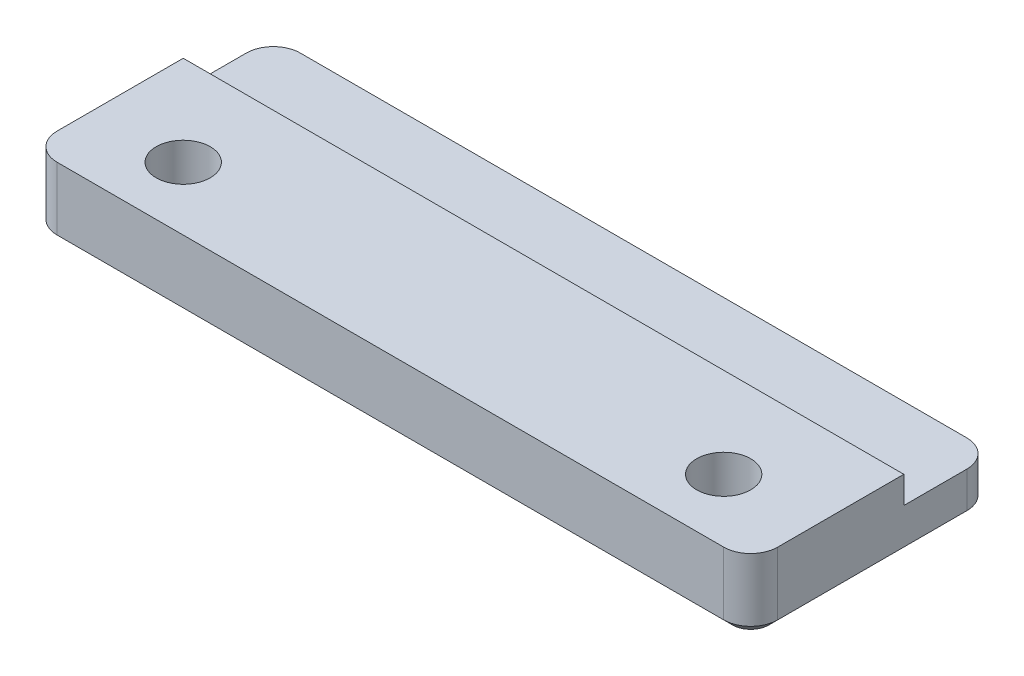
ISO-10303-21;
HEADER;
FILE_DESCRIPTION(('STEP AP214'),'2;1');
FILE_NAME('part.step','',(''),(''),'','','');
FILE_SCHEMA(('AUTOMOTIVE_DESIGN { 1 0 10303 214 1 1 1 1 }'));
ENDSEC;
DATA;
#1=APPLICATION_CONTEXT('core data for automotive mechanical design processes');
#2=APPLICATION_PROTOCOL_DEFINITION('international standard','automotive_design',2000,#1);
#3=PRODUCT_CONTEXT('',#1,'mechanical');
#4=PRODUCT('Part','Part','',(#3));
#5=PRODUCT_RELATED_PRODUCT_CATEGORY('part','',(#4));
#6=PRODUCT_DEFINITION_FORMATION('','',#4);
#7=PRODUCT_DEFINITION_CONTEXT('part definition',#1,'design');
#8=PRODUCT_DEFINITION('design','',#6,#7);
#9=PRODUCT_DEFINITION_SHAPE('','',#8);
#10=(LENGTH_UNIT() NAMED_UNIT(*) SI_UNIT(.MILLI.,.METRE.));
#11=(NAMED_UNIT(*) PLANE_ANGLE_UNIT() SI_UNIT($,.RADIAN.));
#12=(NAMED_UNIT(*) SI_UNIT($,.STERADIAN.) SOLID_ANGLE_UNIT());
#13=UNCERTAINTY_MEASURE_WITH_UNIT(LENGTH_MEASURE(1.E-05),#10,'distance_accuracy_value','');
#14=(GEOMETRIC_REPRESENTATION_CONTEXT(3) GLOBAL_UNCERTAINTY_ASSIGNED_CONTEXT((#13)) GLOBAL_UNIT_ASSIGNED_CONTEXT((#10,
#11,#12)) REPRESENTATION_CONTEXT('',''));
#15=CARTESIAN_POINT('',(0.,0.,0.));
#16=DIRECTION('',(0.,0.,1.));
#17=DIRECTION('',(1.,0.,0.));
#18=AXIS2_PLACEMENT_3D('',#15,#16,#17);
#19=CARTESIAN_POINT('',(0.,8.,7.));
#20=DIRECTION('',(0.,0.,1.));
#21=DIRECTION('',(1.,0.,0.));
#22=AXIS2_PLACEMENT_3D('',#19,#20,#21);
#23=PLANE('',#22);
#24=DIRECTION('',(0.,-1.,0.));
#25=VECTOR('',#24,1.);
#26=CARTESIAN_POINT('',(-37.,0.,7.));
#27=LINE('',#26,#25);
#28=CARTESIAN_POINT('',(-37.,8.,7.));
#29=VERTEX_POINT('',#28);
#30=CARTESIAN_POINT('',(-37.,1.,7.));
#31=VERTEX_POINT('',#30);
#32=EDGE_CURVE('E200',#29,#31,#27,.T.);
#33=ORIENTED_EDGE('',*,*,#32,.T.);
#34=DIRECTION('',(1.,0.,0.));
#35=VECTOR('',#34,1.);
#36=CARTESIAN_POINT('',(37.,1.,7.));
#37=LINE('',#36,#35);
#38=CARTESIAN_POINT('',(37.,1.,7.));
#39=VERTEX_POINT('',#38);
#40=EDGE_CURVE('E244',#31,#39,#37,.T.);
#41=ORIENTED_EDGE('',*,*,#40,.T.);
#42=DIRECTION('',(0.,-1.,0.));
#43=VECTOR('',#42,1.);
#44=CARTESIAN_POINT('',(37.,8.,7.));
#45=LINE('',#44,#43);
#46=CARTESIAN_POINT('',(37.,8.,7.));
#47=VERTEX_POINT('',#46);
#48=EDGE_CURVE('E198',#39,#47,#45,.F.);
#49=ORIENTED_EDGE('',*,*,#48,.T.);
#50=DIRECTION('',(-1.,0.,0.));
#51=VECTOR('',#50,1.);
#52=CARTESIAN_POINT('',(0.,8.,7.));
#53=LINE('',#52,#51);
#54=EDGE_CURVE('E172',#47,#29,#53,.T.);
#55=ORIENTED_EDGE('',*,*,#54,.T.);
#56=EDGE_LOOP('',(#33,#41,#49,#55));
#57=FACE_BOUND('',#56,.T.);
#58=ADVANCED_FACE('F37',(#57),#23,.T.);
#59=CARTESIAN_POINT('',(40.,8.,0.));
#60=DIRECTION('',(1.,0.,0.));
#61=DIRECTION('',(0.,0.,-1.));
#62=AXIS2_PLACEMENT_3D('',#59,#60,#61);
#63=PLANE('',#62);
#64=DIRECTION('',(0.,-1.,0.));
#65=VECTOR('',#64,1.);
#66=CARTESIAN_POINT('',(40.,8.,4.));
#67=LINE('',#66,#65);
#68=CARTESIAN_POINT('',(40.,8.,4.));
#69=VERTEX_POINT('',#68);
#70=CARTESIAN_POINT('',(40.,1.,4.));
#71=VERTEX_POINT('',#70);
#72=EDGE_CURVE('E209',#69,#71,#67,.T.);
#73=ORIENTED_EDGE('',*,*,#72,.T.);
#74=DIRECTION('',(0.,0.,-1.));
#75=VECTOR('',#74,1.);
#76=CARTESIAN_POINT('',(40.,1.,-17.));
#77=LINE('',#76,#75);
#78=CARTESIAN_POINT('',(40.,1.,-17.));
#79=VERTEX_POINT('',#78);
#80=EDGE_CURVE('E248',#71,#79,#77,.T.);
#81=ORIENTED_EDGE('',*,*,#80,.T.);
#82=DIRECTION('',(0.,-1.,0.));
#83=VECTOR('',#82,1.);
#84=CARTESIAN_POINT('',(40.,8.,-17.));
#85=LINE('',#84,#83);
#86=CARTESIAN_POINT('',(40.,5.,-17.));
#87=VERTEX_POINT('',#86);
#88=EDGE_CURVE('E207',#79,#87,#85,.F.);
#89=ORIENTED_EDGE('',*,*,#88,.T.);
#90=DIRECTION('',(0.,0.,-1.));
#91=VECTOR('',#90,1.);
#92=CARTESIAN_POINT('',(40.,5.,-20.));
#93=LINE('',#92,#91);
#94=CARTESIAN_POINT('',(40.,5.,-10.));
#95=VERTEX_POINT('',#94);
#96=EDGE_CURVE('E166',#95,#87,#93,.T.);
#97=ORIENTED_EDGE('',*,*,#96,.F.);
#98=DIRECTION('',(0.,-1.,0.));
#99=VECTOR('',#98,1.);
#100=CARTESIAN_POINT('',(40.,8.,-10.));
#101=LINE('',#100,#99);
#102=CARTESIAN_POINT('',(40.,8.,-10.));
#103=VERTEX_POINT('',#102);
#104=EDGE_CURVE('E147',#103,#95,#101,.T.);
#105=ORIENTED_EDGE('',*,*,#104,.F.);
#106=DIRECTION('',(0.,0.,1.));
#107=VECTOR('',#106,1.);
#108=CARTESIAN_POINT('',(40.,8.,0.));
#109=LINE('',#108,#107);
#110=EDGE_CURVE('E177',#103,#69,#109,.T.);
#111=ORIENTED_EDGE('',*,*,#110,.T.);
#112=EDGE_LOOP('',(#73,#81,#89,#97,#105,#111));
#113=FACE_BOUND('',#112,.T.);
#114=ADVANCED_FACE('F325',(#113),#63,.T.);
#115=CARTESIAN_POINT('',(0.,8.,-20.));
#116=DIRECTION('',(0.,0.,-1.));
#117=DIRECTION('',(-1.,0.,0.));
#118=AXIS2_PLACEMENT_3D('',#115,#116,#117);
#119=PLANE('',#118);
#120=DIRECTION('',(0.,-1.,0.));
#121=VECTOR('',#120,1.);
#122=CARTESIAN_POINT('',(37.,8.,-20.));
#123=LINE('',#122,#121);
#124=CARTESIAN_POINT('',(37.,5.,-20.));
#125=VERTEX_POINT('',#124);
#126=CARTESIAN_POINT('',(37.,1.,-20.));
#127=VERTEX_POINT('',#126);
#128=EDGE_CURVE('E191',#125,#127,#123,.T.);
#129=ORIENTED_EDGE('',*,*,#128,.T.);
#130=DIRECTION('',(-1.,0.,0.));
#131=VECTOR('',#130,1.);
#132=CARTESIAN_POINT('',(-37.,1.,-20.));
#133=LINE('',#132,#131);
#134=CARTESIAN_POINT('',(-37.,1.,-20.));
#135=VERTEX_POINT('',#134);
#136=EDGE_CURVE('E62',#127,#135,#133,.T.);
#137=ORIENTED_EDGE('',*,*,#136,.T.);
#138=DIRECTION('',(0.,-1.,0.));
#139=VECTOR('',#138,1.);
#140=CARTESIAN_POINT('',(-37.,5.,-20.));
#141=LINE('',#140,#139);
#142=CARTESIAN_POINT('',(-37.,5.,-20.));
#143=VERTEX_POINT('',#142);
#144=EDGE_CURVE('E193',#135,#143,#141,.F.);
#145=ORIENTED_EDGE('',*,*,#144,.T.);
#146=DIRECTION('',(1.,0.,0.));
#147=VECTOR('',#146,1.);
#148=CARTESIAN_POINT('',(-40.,5.,-20.));
#149=LINE('',#148,#147);
#150=EDGE_CURVE('E151',#143,#125,#149,.T.);
#151=ORIENTED_EDGE('',*,*,#150,.T.);
#152=EDGE_LOOP('',(#129,#137,#145,#151));
#153=FACE_BOUND('',#152,.T.);
#154=ADVANCED_FACE('F289',(#153),#119,.T.);
#155=CARTESIAN_POINT('',(30.,8.,0.));
#156=DIRECTION('',(0.,-1.,0.));
#157=DIRECTION('',(0.,0.,-1.));
#158=AXIS2_PLACEMENT_3D('',#155,#156,#157);
#159=CYLINDRICAL_SURFACE('',#158,3.);
#160=CARTESIAN_POINT('',(30.,0.999999999999992,0.));
#161=DIRECTION('',(0.,1.,0.));
#162=DIRECTION('',(0.,0.,1.));
#163=AXIS2_PLACEMENT_3D('',#160,#161,#162);
#164=CIRCLE('',#163,3.);
#165=CARTESIAN_POINT('',(30.,0.999999999999992,3.));
#166=VERTEX_POINT('',#165);
#167=EDGE_CURVE('E238',#166,#166,#164,.F.);
#168=ORIENTED_EDGE('',*,*,#167,.T.);
#169=EDGE_LOOP('',(#168));
#170=FACE_BOUND('',#169,.T.);
#171=CARTESIAN_POINT('',(30.,8.,0.));
#172=DIRECTION('',(0.,1.,0.));
#173=DIRECTION('',(0.,0.,1.));
#174=AXIS2_PLACEMENT_3D('',#171,#172,#173);
#175=CIRCLE('',#174,3.);
#176=CARTESIAN_POINT('',(30.,8.,3.));
#177=VERTEX_POINT('',#176);
#178=EDGE_CURVE('E181',#177,#177,#175,.T.);
#179=ORIENTED_EDGE('',*,*,#178,.T.);
#180=EDGE_LOOP('',(#179));
#181=FACE_BOUND('',#180,.T.);
#182=ADVANCED_FACE('F332',(#170,#181),#159,.F.);
#183=CARTESIAN_POINT('',(-40.,8.,0.));
#184=DIRECTION('',(1.,0.,0.));
#185=DIRECTION('',(0.,0.,-1.));
#186=AXIS2_PLACEMENT_3D('',#183,#184,#185);
#187=PLANE('',#186);
#188=DIRECTION('',(0.,-1.,0.));
#189=VECTOR('',#188,1.);
#190=CARTESIAN_POINT('',(-40.,0.,-17.));
#191=LINE('',#190,#189);
#192=CARTESIAN_POINT('',(-40.,5.,-17.));
#193=VERTEX_POINT('',#192);
#194=CARTESIAN_POINT('',(-40.,1.,-17.));
#195=VERTEX_POINT('',#194);
#196=EDGE_CURVE('E189',#193,#195,#191,.T.);
#197=ORIENTED_EDGE('',*,*,#196,.T.);
#198=DIRECTION('',(0.,0.,1.));
#199=VECTOR('',#198,1.);
#200=CARTESIAN_POINT('',(-40.,1.,0.));
#201=LINE('',#200,#199);
#202=CARTESIAN_POINT('',(-40.,1.,4.));
#203=VERTEX_POINT('',#202);
#204=EDGE_CURVE('E11',#195,#203,#201,.T.);
#205=ORIENTED_EDGE('',*,*,#204,.T.);
#206=DIRECTION('',(0.,-1.,0.));
#207=VECTOR('',#206,1.);
#208=CARTESIAN_POINT('',(-40.,8.,4.));
#209=LINE('',#208,#207);
#210=CARTESIAN_POINT('',(-40.,8.,4.));
#211=VERTEX_POINT('',#210);
#212=EDGE_CURVE('E187',#203,#211,#209,.F.);
#213=ORIENTED_EDGE('',*,*,#212,.T.);
#214=DIRECTION('',(0.,0.,1.));
#215=VECTOR('',#214,1.);
#216=CARTESIAN_POINT('',(-40.,8.,0.));
#217=LINE('',#216,#215);
#218=CARTESIAN_POINT('',(-40.,8.,-10.));
#219=VERTEX_POINT('',#218);
#220=EDGE_CURVE('E165',#219,#211,#217,.T.);
#221=ORIENTED_EDGE('',*,*,#220,.F.);
#222=DIRECTION('',(0.,-1.,0.));
#223=VECTOR('',#222,1.);
#224=CARTESIAN_POINT('',(-40.,8.,-10.));
#225=LINE('',#224,#223);
#226=CARTESIAN_POINT('',(-40.,5.,-10.));
#227=VERTEX_POINT('',#226);
#228=EDGE_CURVE('E144',#219,#227,#225,.T.);
#229=ORIENTED_EDGE('',*,*,#228,.T.);
#230=DIRECTION('',(0.,0.,-1.));
#231=VECTOR('',#230,1.);
#232=CARTESIAN_POINT('',(-40.,5.,-20.));
#233=LINE('',#232,#231);
#234=EDGE_CURVE('E155',#227,#193,#233,.T.);
#235=ORIENTED_EDGE('',*,*,#234,.T.);
#236=EDGE_LOOP('',(#197,#205,#213,#221,#229,#235));
#237=FACE_BOUND('',#236,.T.);
#238=ADVANCED_FACE('F163',(#237),#187,.F.);
#239=CARTESIAN_POINT('',(-30.,8.,0.));
#240=DIRECTION('',(0.,-1.,0.));
#241=DIRECTION('',(0.,0.,-1.));
#242=AXIS2_PLACEMENT_3D('',#239,#240,#241);
#243=CYLINDRICAL_SURFACE('',#242,3.);
#244=CARTESIAN_POINT('',(-30.,1.00000000000001,0.));
#245=DIRECTION('',(0.,1.,0.));
#246=DIRECTION('',(0.,0.,1.));
#247=AXIS2_PLACEMENT_3D('',#244,#245,#246);
#248=CIRCLE('',#247,3.);
#249=CARTESIAN_POINT('',(-30.,1.00000000000001,3.));
#250=VERTEX_POINT('',#249);
#251=EDGE_CURVE('E212',#250,#250,#248,.F.);
#252=ORIENTED_EDGE('',*,*,#251,.T.);
#253=EDGE_LOOP('',(#252));
#254=FACE_BOUND('',#253,.T.);
#255=CARTESIAN_POINT('',(-30.,8.,0.));
#256=DIRECTION('',(0.,1.,0.));
#257=DIRECTION('',(0.,0.,1.));
#258=AXIS2_PLACEMENT_3D('',#255,#256,#257);
#259=CIRCLE('',#258,3.);
#260=CARTESIAN_POINT('',(-30.,8.,3.));
#261=VERTEX_POINT('',#260);
#262=EDGE_CURVE('E184',#261,#261,#259,.F.);
#263=ORIENTED_EDGE('',*,*,#262,.F.);
#264=EDGE_LOOP('',(#263));
#265=FACE_BOUND('',#264,.T.);
#266=ADVANCED_FACE('F454',(#254,#265),#243,.F.);
#267=CARTESIAN_POINT('',(0.,8.,0.));
#268=DIRECTION('',(0.,1.,0.));
#269=DIRECTION('',(0.,0.,1.));
#270=AXIS2_PLACEMENT_3D('',#267,#268,#269);
#271=PLANE('',#270);
#272=ORIENTED_EDGE('',*,*,#220,.T.);
#273=CARTESIAN_POINT('',(-37.,8.,4.));
#274=DIRECTION('',(0.,1.,0.));
#275=DIRECTION('',(0.,0.,1.));
#276=AXIS2_PLACEMENT_3D('',#273,#274,#275);
#277=CIRCLE('',#276,3.);
#278=EDGE_CURVE('E205',#211,#29,#277,.T.);
#279=ORIENTED_EDGE('',*,*,#278,.T.);
#280=ORIENTED_EDGE('',*,*,#54,.F.);
#281=CARTESIAN_POINT('',(37.,8.,4.));
#282=DIRECTION('',(0.,1.,0.));
#283=DIRECTION('',(0.,0.,1.));
#284=AXIS2_PLACEMENT_3D('',#281,#282,#283);
#285=CIRCLE('',#284,3.);
#286=EDGE_CURVE('E203',#47,#69,#285,.T.);
#287=ORIENTED_EDGE('',*,*,#286,.T.);
#288=ORIENTED_EDGE('',*,*,#110,.F.);
#289=DIRECTION('',(1.,0.,0.));
#290=VECTOR('',#289,1.);
#291=CARTESIAN_POINT('',(-40.,8.,-10.));
#292=LINE('',#291,#290);
#293=EDGE_CURVE('E152',#219,#103,#292,.T.);
#294=ORIENTED_EDGE('',*,*,#293,.F.);
#295=EDGE_LOOP('',(#272,#279,#280,#287,#288,#294));
#296=FACE_BOUND('',#295,.T.);
#297=ORIENTED_EDGE('',*,*,#178,.F.);
#298=EDGE_LOOP('',(#297));
#299=FACE_BOUND('',#298,.T.);
#300=ORIENTED_EDGE('',*,*,#262,.T.);
#301=EDGE_LOOP('',(#300));
#302=FACE_BOUND('',#301,.T.);
#303=ADVANCED_FACE('F317',(#296,#299,#302),#271,.T.);
#304=CARTESIAN_POINT('',(0.,0.,0.));
#305=DIRECTION('',(0.,1.,0.));
#306=DIRECTION('',(0.,0.,1.));
#307=AXIS2_PLACEMENT_3D('',#304,#305,#306);
#308=PLANE('',#307);
#309=CARTESIAN_POINT('',(-30.,0.,0.));
#310=DIRECTION('',(0.,1.,0.));
#311=DIRECTION('',(0.,0.,1.));
#312=AXIS2_PLACEMENT_3D('',#309,#310,#311);
#313=CIRCLE('',#312,4.00000000000001);
#314=CARTESIAN_POINT('',(-30.,0.,4.00000000000001));
#315=VERTEX_POINT('',#314);
#316=EDGE_CURVE('E235',#315,#315,#313,.T.);
#317=ORIENTED_EDGE('',*,*,#316,.T.);
#318=EDGE_LOOP('',(#317));
#319=FACE_BOUND('',#318,.T.);
#320=CARTESIAN_POINT('',(30.,0.,0.));
#321=DIRECTION('',(0.,1.,0.));
#322=DIRECTION('',(0.,0.,1.));
#323=AXIS2_PLACEMENT_3D('',#320,#321,#322);
#324=CIRCLE('',#323,3.99999999999999);
#325=CARTESIAN_POINT('',(30.,0.,3.99999999999999));
#326=VERTEX_POINT('',#325);
#327=EDGE_CURVE('E232',#326,#326,#324,.T.);
#328=ORIENTED_EDGE('',*,*,#327,.T.);
#329=EDGE_LOOP('',(#328));
#330=FACE_BOUND('',#329,.T.);
#331=DIRECTION('',(-1.,0.,0.));
#332=VECTOR('',#331,1.);
#333=CARTESIAN_POINT('',(-37.,0.,5.99999999999999));
#334=LINE('',#333,#332);
#335=CARTESIAN_POINT('',(37.,0.,5.99999999999999));
#336=VERTEX_POINT('',#335);
#337=CARTESIAN_POINT('',(-37.,0.,5.99999999999999));
#338=VERTEX_POINT('',#337);
#339=EDGE_CURVE('E227',#336,#338,#334,.T.);
#340=ORIENTED_EDGE('',*,*,#339,.T.);
#341=CARTESIAN_POINT('',(-37.,0.,4.));
#342=DIRECTION('',(0.,1.,0.));
#343=DIRECTION('',(0.,0.,1.));
#344=AXIS2_PLACEMENT_3D('',#341,#342,#343);
#345=CIRCLE('',#344,1.99999999999999);
#346=CARTESIAN_POINT('',(-39.,0.,4.));
#347=VERTEX_POINT('',#346);
#348=EDGE_CURVE('E229',#338,#347,#345,.F.);
#349=ORIENTED_EDGE('',*,*,#348,.T.);
#350=DIRECTION('',(0.,0.,-1.));
#351=VECTOR('',#350,1.);
#352=CARTESIAN_POINT('',(-39.,0.,0.));
#353=LINE('',#352,#351);
#354=CARTESIAN_POINT('',(-39.,0.,-17.));
#355=VERTEX_POINT('',#354);
#356=EDGE_CURVE('E215',#347,#355,#353,.T.);
#357=ORIENTED_EDGE('',*,*,#356,.T.);
#358=CARTESIAN_POINT('',(-37.,0.,-17.));
#359=DIRECTION('',(0.,1.,0.));
#360=DIRECTION('',(0.,0.,1.));
#361=AXIS2_PLACEMENT_3D('',#358,#359,#360);
#362=CIRCLE('',#361,1.99999999999999);
#363=CARTESIAN_POINT('',(-37.,0.,-19.));
#364=VERTEX_POINT('',#363);
#365=EDGE_CURVE('E217',#355,#364,#362,.F.);
#366=ORIENTED_EDGE('',*,*,#365,.T.);
#367=DIRECTION('',(1.,0.,0.));
#368=VECTOR('',#367,1.);
#369=CARTESIAN_POINT('',(37.,0.,-19.));
#370=LINE('',#369,#368);
#371=CARTESIAN_POINT('',(37.,0.,-19.));
#372=VERTEX_POINT('',#371);
#373=EDGE_CURVE('E219',#364,#372,#370,.T.);
#374=ORIENTED_EDGE('',*,*,#373,.T.);
#375=CARTESIAN_POINT('',(37.,0.,-17.));
#376=DIRECTION('',(0.,1.,0.));
#377=DIRECTION('',(0.,0.,1.));
#378=AXIS2_PLACEMENT_3D('',#375,#376,#377);
#379=CIRCLE('',#378,1.99999999999999);
#380=CARTESIAN_POINT('',(39.,0.,-17.));
#381=VERTEX_POINT('',#380);
#382=EDGE_CURVE('E221',#372,#381,#379,.F.);
#383=ORIENTED_EDGE('',*,*,#382,.T.);
#384=DIRECTION('',(0.,0.,1.));
#385=VECTOR('',#384,1.);
#386=CARTESIAN_POINT('',(39.,0.,4.));
#387=LINE('',#386,#385);
#388=CARTESIAN_POINT('',(39.,0.,4.));
#389=VERTEX_POINT('',#388);
#390=EDGE_CURVE('E223',#381,#389,#387,.T.);
#391=ORIENTED_EDGE('',*,*,#390,.T.);
#392=CARTESIAN_POINT('',(37.,0.,4.));
#393=DIRECTION('',(0.,1.,0.));
#394=DIRECTION('',(0.,0.,1.));
#395=AXIS2_PLACEMENT_3D('',#392,#393,#394);
#396=CIRCLE('',#395,1.99999999999999);
#397=EDGE_CURVE('E225',#389,#336,#396,.F.);
#398=ORIENTED_EDGE('',*,*,#397,.T.);
#399=EDGE_LOOP('',(#340,#349,#357,#366,#374,#383,#391,#398));
#400=FACE_BOUND('',#399,.T.);
#401=ADVANCED_FACE('F440',(#319,#330,#400),#308,.F.);
#402=CARTESIAN_POINT('',(-40.,5.,-20.));
#403=DIRECTION('',(0.,-1.,0.));
#404=DIRECTION('',(0.,0.,-1.));
#405=AXIS2_PLACEMENT_3D('',#402,#403,#404);
#406=PLANE('',#405);
#407=ORIENTED_EDGE('',*,*,#150,.F.);
#408=CARTESIAN_POINT('',(-37.,5.,-17.));
#409=DIRECTION('',(0.,-1.,0.));
#410=DIRECTION('',(0.,0.,-1.));
#411=AXIS2_PLACEMENT_3D('',#408,#409,#410);
#412=CIRCLE('',#411,3.);
#413=EDGE_CURVE('E159',#143,#193,#412,.F.);
#414=ORIENTED_EDGE('',*,*,#413,.T.);
#415=ORIENTED_EDGE('',*,*,#234,.F.);
#416=DIRECTION('',(1.,0.,0.));
#417=VECTOR('',#416,1.);
#418=CARTESIAN_POINT('',(-40.,5.,-10.));
#419=LINE('',#418,#417);
#420=EDGE_CURVE('E140',#227,#95,#419,.T.);
#421=ORIENTED_EDGE('',*,*,#420,.T.);
#422=ORIENTED_EDGE('',*,*,#96,.T.);
#423=CARTESIAN_POINT('',(37.,5.,-17.));
#424=DIRECTION('',(0.,-1.,0.));
#425=DIRECTION('',(0.,0.,-1.));
#426=AXIS2_PLACEMENT_3D('',#423,#424,#425);
#427=CIRCLE('',#426,3.);
#428=EDGE_CURVE('E195',#87,#125,#427,.F.);
#429=ORIENTED_EDGE('',*,*,#428,.T.);
#430=EDGE_LOOP('',(#407,#414,#415,#421,#422,#429));
#431=FACE_BOUND('',#430,.T.);
#432=ADVANCED_FACE('F157',(#431),#406,.F.);
#433=CARTESIAN_POINT('',(-40.,8.,-10.));
#434=DIRECTION('',(0.,0.,1.));
#435=DIRECTION('',(1.,0.,0.));
#436=AXIS2_PLACEMENT_3D('',#433,#434,#435);
#437=PLANE('',#436);
#438=ORIENTED_EDGE('',*,*,#104,.T.);
#439=ORIENTED_EDGE('',*,*,#420,.F.);
#440=ORIENTED_EDGE('',*,*,#228,.F.);
#441=ORIENTED_EDGE('',*,*,#293,.T.);
#442=EDGE_LOOP('',(#438,#439,#440,#441));
#443=FACE_BOUND('',#442,.T.);
#444=ADVANCED_FACE('F142',(#443),#437,.F.);
#445=CARTESIAN_POINT('',(-37.,8.,-17.));
#446=DIRECTION('',(0.,1.,0.));
#447=DIRECTION('',(0.,0.,1.));
#448=AXIS2_PLACEMENT_3D('',#445,#446,#447);
#449=CYLINDRICAL_SURFACE('',#448,3.);
#450=ORIENTED_EDGE('',*,*,#144,.F.);
#451=CARTESIAN_POINT('',(-37.,1.,-17.));
#452=DIRECTION('',(0.,1.,0.));
#453=DIRECTION('',(0.,0.,1.));
#454=AXIS2_PLACEMENT_3D('',#451,#452,#453);
#455=CIRCLE('',#454,3.);
#456=EDGE_CURVE('E47',#135,#195,#455,.T.);
#457=ORIENTED_EDGE('',*,*,#456,.T.);
#458=ORIENTED_EDGE('',*,*,#196,.F.);
#459=ORIENTED_EDGE('',*,*,#413,.F.);
#460=EDGE_LOOP('',(#450,#457,#458,#459));
#461=FACE_BOUND('',#460,.T.);
#462=ADVANCED_FACE('F290',(#461),#449,.T.);
#463=CARTESIAN_POINT('',(-37.,8.,4.));
#464=DIRECTION('',(0.,1.,0.));
#465=DIRECTION('',(0.,0.,1.));
#466=AXIS2_PLACEMENT_3D('',#463,#464,#465);
#467=CYLINDRICAL_SURFACE('',#466,3.);
#468=ORIENTED_EDGE('',*,*,#212,.F.);
#469=CARTESIAN_POINT('',(-37.,1.,4.));
#470=DIRECTION('',(0.,1.,0.));
#471=DIRECTION('',(0.,0.,1.));
#472=AXIS2_PLACEMENT_3D('',#469,#470,#471);
#473=CIRCLE('',#472,3.);
#474=EDGE_CURVE('E241',#203,#31,#473,.T.);
#475=ORIENTED_EDGE('',*,*,#474,.T.);
#476=ORIENTED_EDGE('',*,*,#32,.F.);
#477=ORIENTED_EDGE('',*,*,#278,.F.);
#478=EDGE_LOOP('',(#468,#475,#476,#477));
#479=FACE_BOUND('',#478,.T.);
#480=ADVANCED_FACE('F310',(#479),#467,.T.);
#481=CARTESIAN_POINT('',(37.,8.,4.));
#482=DIRECTION('',(0.,-1.,0.));
#483=DIRECTION('',(0.,0.,-1.));
#484=AXIS2_PLACEMENT_3D('',#481,#482,#483);
#485=CYLINDRICAL_SURFACE('',#484,3.);
#486=ORIENTED_EDGE('',*,*,#48,.F.);
#487=CARTESIAN_POINT('',(37.,1.,4.));
#488=DIRECTION('',(0.,1.,0.));
#489=DIRECTION('',(0.,0.,1.));
#490=AXIS2_PLACEMENT_3D('',#487,#488,#489);
#491=CIRCLE('',#490,3.);
#492=EDGE_CURVE('E246',#39,#71,#491,.T.);
#493=ORIENTED_EDGE('',*,*,#492,.T.);
#494=ORIENTED_EDGE('',*,*,#72,.F.);
#495=ORIENTED_EDGE('',*,*,#286,.F.);
#496=EDGE_LOOP('',(#486,#493,#494,#495));
#497=FACE_BOUND('',#496,.T.);
#498=ADVANCED_FACE('F322',(#497),#485,.T.);
#499=CARTESIAN_POINT('',(37.,8.,-17.));
#500=DIRECTION('',(0.,-1.,0.));
#501=DIRECTION('',(0.,0.,-1.));
#502=AXIS2_PLACEMENT_3D('',#499,#500,#501);
#503=CYLINDRICAL_SURFACE('',#502,3.);
#504=ORIENTED_EDGE('',*,*,#88,.F.);
#505=CARTESIAN_POINT('',(37.,1.,-17.));
#506=DIRECTION('',(0.,1.,0.));
#507=DIRECTION('',(0.,0.,1.));
#508=AXIS2_PLACEMENT_3D('',#505,#506,#507);
#509=CIRCLE('',#508,3.);
#510=EDGE_CURVE('E250',#79,#127,#509,.T.);
#511=ORIENTED_EDGE('',*,*,#510,.T.);
#512=ORIENTED_EDGE('',*,*,#128,.F.);
#513=ORIENTED_EDGE('',*,*,#428,.F.);
#514=EDGE_LOOP('',(#504,#511,#512,#513));
#515=FACE_BOUND('',#514,.T.);
#516=ADVANCED_FACE('F287',(#515),#503,.T.);
#517=CARTESIAN_POINT('',(-30.,1.00000000000001,0.));
#518=DIRECTION('',(0.,-1.,0.));
#519=DIRECTION('',(0.,0.,-1.));
#520=AXIS2_PLACEMENT_3D('',#517,#518,#519);
#521=CONICAL_SURFACE('',#520,3.,0.78539816339745);
#522=ORIENTED_EDGE('',*,*,#316,.F.);
#523=EDGE_LOOP('',(#522));
#524=FACE_BOUND('',#523,.T.);
#525=ORIENTED_EDGE('',*,*,#251,.F.);
#526=EDGE_LOOP('',(#525));
#527=FACE_BOUND('',#526,.T.);
#528=ADVANCED_FACE('F345',(#524,#527),#521,.F.);
#529=CARTESIAN_POINT('',(30.,0.,0.));
#530=DIRECTION('',(0.,-1.,0.));
#531=DIRECTION('',(0.,0.,-1.));
#532=AXIS2_PLACEMENT_3D('',#529,#530,#531);
#533=CONICAL_SURFACE('',#532,3.99999999999999,0.785398163397446);
#534=ORIENTED_EDGE('',*,*,#167,.F.);
#535=EDGE_LOOP('',(#534));
#536=FACE_BOUND('',#535,.T.);
#537=ORIENTED_EDGE('',*,*,#327,.F.);
#538=EDGE_LOOP('',(#537));
#539=FACE_BOUND('',#538,.T.);
#540=ADVANCED_FACE('F352',(#536,#539),#533,.F.);
#541=CARTESIAN_POINT('',(37.,0.,-17.));
#542=DIRECTION('',(0.,1.,0.));
#543=DIRECTION('',(0.,0.,1.));
#544=AXIS2_PLACEMENT_3D('',#541,#542,#543);
#545=CONICAL_SURFACE('',#544,1.99999999999999,0.78539816339745);
#546=DIRECTION('',(0.,-0.707106781186546,0.707106781186549));
#547=VECTOR('',#546,1.);
#548=CARTESIAN_POINT('',(37.,1.,-20.));
#549=LINE('',#548,#547);
#550=EDGE_CURVE('E269',#127,#372,#549,.T.);
#551=ORIENTED_EDGE('',*,*,#550,.F.);
#552=ORIENTED_EDGE('',*,*,#510,.F.);
#553=DIRECTION('',(0.70710678118655,0.707106781186545,0.));
#554=VECTOR('',#553,1.);
#555=CARTESIAN_POINT('',(39.,0.,-17.));
#556=LINE('',#555,#554);
#557=EDGE_CURVE('E42',#381,#79,#556,.T.);
#558=ORIENTED_EDGE('',*,*,#557,.F.);
#559=ORIENTED_EDGE('',*,*,#382,.F.);
#560=EDGE_LOOP('',(#551,#552,#558,#559));
#561=FACE_BOUND('',#560,.T.);
#562=ADVANCED_FACE('F40',(#561),#545,.T.);
#563=CARTESIAN_POINT('',(39.,0.,0.));
#564=DIRECTION('',(0.707106781186545,-0.70710678118655,0.));
#565=DIRECTION('',(0.,0.,-1.));
#566=AXIS2_PLACEMENT_3D('',#563,#564,#565);
#567=PLANE('',#566);
#568=ORIENTED_EDGE('',*,*,#557,.T.);
#569=ORIENTED_EDGE('',*,*,#80,.F.);
#570=DIRECTION('',(0.70710678118655,0.707106781186545,0.));
#571=VECTOR('',#570,1.);
#572=CARTESIAN_POINT('',(39.,0.,4.));
#573=LINE('',#572,#571);
#574=EDGE_CURVE('E267',#389,#71,#573,.T.);
#575=ORIENTED_EDGE('',*,*,#574,.F.);
#576=ORIENTED_EDGE('',*,*,#390,.F.);
#577=EDGE_LOOP('',(#568,#569,#575,#576));
#578=FACE_BOUND('',#577,.T.);
#579=ADVANCED_FACE('F279',(#578),#567,.T.);
#580=CARTESIAN_POINT('',(0.,0.,-19.));
#581=DIRECTION('',(0.,-0.70710678118655,-0.707106781186545));
#582=DIRECTION('',(-1.,0.,0.));
#583=AXIS2_PLACEMENT_3D('',#580,#581,#582);
#584=PLANE('',#583);
#585=ORIENTED_EDGE('',*,*,#550,.T.);
#586=ORIENTED_EDGE('',*,*,#373,.F.);
#587=DIRECTION('',(0.,-0.707106781186545,0.70710678118655));
#588=VECTOR('',#587,1.);
#589=CARTESIAN_POINT('',(-37.,1.,-20.));
#590=LINE('',#589,#588);
#591=EDGE_CURVE('E264',#135,#364,#590,.T.);
#592=ORIENTED_EDGE('',*,*,#591,.F.);
#593=ORIENTED_EDGE('',*,*,#136,.F.);
#594=EDGE_LOOP('',(#585,#586,#592,#593));
#595=FACE_BOUND('',#594,.T.);
#596=ADVANCED_FACE('F388',(#595),#584,.T.);
#597=CARTESIAN_POINT('',(37.,0.,4.));
#598=DIRECTION('',(0.,1.,0.));
#599=DIRECTION('',(0.,0.,1.));
#600=AXIS2_PLACEMENT_3D('',#597,#598,#599);
#601=CONICAL_SURFACE('',#600,1.99999999999999,0.785398163397452);
#602=ORIENTED_EDGE('',*,*,#574,.T.);
#603=ORIENTED_EDGE('',*,*,#492,.F.);
#604=DIRECTION('',(0.,0.707106781186545,0.70710678118655));
#605=VECTOR('',#604,1.);
#606=CARTESIAN_POINT('',(37.,0.,5.99999999999999));
#607=LINE('',#606,#605);
#608=EDGE_CURVE('E261',#336,#39,#607,.T.);
#609=ORIENTED_EDGE('',*,*,#608,.F.);
#610=ORIENTED_EDGE('',*,*,#397,.F.);
#611=EDGE_LOOP('',(#602,#603,#609,#610));
#612=FACE_BOUND('',#611,.T.);
#613=ADVANCED_FACE('F382',(#612),#601,.T.);
#614=CARTESIAN_POINT('',(-37.,0.,-17.));
#615=DIRECTION('',(0.,1.,0.));
#616=DIRECTION('',(0.,0.,1.));
#617=AXIS2_PLACEMENT_3D('',#614,#615,#616);
#618=CONICAL_SURFACE('',#617,1.99999999999999,0.785398163397452);
#619=ORIENTED_EDGE('',*,*,#591,.T.);
#620=ORIENTED_EDGE('',*,*,#365,.F.);
#621=DIRECTION('',(0.70710678118655,-0.707106781186545,0.));
#622=VECTOR('',#621,1.);
#623=CARTESIAN_POINT('',(-40.,1.,-17.));
#624=LINE('',#623,#622);
#625=EDGE_CURVE('E258',#195,#355,#624,.T.);
#626=ORIENTED_EDGE('',*,*,#625,.F.);
#627=ORIENTED_EDGE('',*,*,#456,.F.);
#628=EDGE_LOOP('',(#619,#620,#626,#627));
#629=FACE_BOUND('',#628,.T.);
#630=ADVANCED_FACE('F297',(#629),#618,.T.);
#631=CARTESIAN_POINT('',(0.,0.,5.99999999999999));
#632=DIRECTION('',(0.,-0.70710678118655,0.707106781186545));
#633=DIRECTION('',(1.,0.,0.));
#634=AXIS2_PLACEMENT_3D('',#631,#632,#633);
#635=PLANE('',#634);
#636=ORIENTED_EDGE('',*,*,#608,.T.);
#637=ORIENTED_EDGE('',*,*,#40,.F.);
#638=DIRECTION('',(0.,0.707106781186545,0.70710678118655));
#639=VECTOR('',#638,1.);
#640=CARTESIAN_POINT('',(-37.,0.,5.99999999999999));
#641=LINE('',#640,#639);
#642=EDGE_CURVE('E256',#338,#31,#641,.T.);
#643=ORIENTED_EDGE('',*,*,#642,.F.);
#644=ORIENTED_EDGE('',*,*,#339,.F.);
#645=EDGE_LOOP('',(#636,#637,#643,#644));
#646=FACE_BOUND('',#645,.T.);
#647=ADVANCED_FACE('F370',(#646),#635,.T.);
#648=CARTESIAN_POINT('',(-40.,1.,0.));
#649=DIRECTION('',(0.707106781186545,0.70710678118655,0.));
#650=DIRECTION('',(0.,0.,1.));
#651=AXIS2_PLACEMENT_3D('',#648,#649,#650);
#652=PLANE('',#651);
#653=ORIENTED_EDGE('',*,*,#625,.T.);
#654=ORIENTED_EDGE('',*,*,#356,.F.);
#655=DIRECTION('',(0.707106781186552,-0.707106781186543,0.));
#656=VECTOR('',#655,1.);
#657=CARTESIAN_POINT('',(-40.,1.,4.));
#658=LINE('',#657,#656);
#659=EDGE_CURVE('E254',#203,#347,#658,.T.);
#660=ORIENTED_EDGE('',*,*,#659,.F.);
#661=ORIENTED_EDGE('',*,*,#204,.F.);
#662=EDGE_LOOP('',(#653,#654,#660,#661));
#663=FACE_BOUND('',#662,.T.);
#664=ADVANCED_FACE('F301',(#663),#652,.F.);
#665=CARTESIAN_POINT('',(-37.,0.,4.));
#666=DIRECTION('',(0.,1.,0.));
#667=DIRECTION('',(0.,0.,1.));
#668=AXIS2_PLACEMENT_3D('',#665,#666,#667);
#669=CONICAL_SURFACE('',#668,1.99999999999999,0.78539816339745);
#670=ORIENTED_EDGE('',*,*,#642,.T.);
#671=ORIENTED_EDGE('',*,*,#474,.F.);
#672=ORIENTED_EDGE('',*,*,#659,.T.);
#673=ORIENTED_EDGE('',*,*,#348,.F.);
#674=EDGE_LOOP('',(#670,#671,#672,#673));
#675=FACE_BOUND('',#674,.T.);
#676=ADVANCED_FACE('F305',(#675),#669,.T.);
#677=CLOSED_SHELL('',(#58,#114,#154,#182,#238,#266,#303,#401,#432,#444,#462,#480,#498,#516,#528,
#540,#562,#579,#596,#613,#630,#647,#664,#676));
#678=MANIFOLD_SOLID_BREP('B2',#677);
#679=ADVANCED_BREP_SHAPE_REPRESENTATION('',(#18,#678),#14);
#680=SHAPE_DEFINITION_REPRESENTATION(#9,#679);
ENDSEC;
END-ISO-10303-21;
